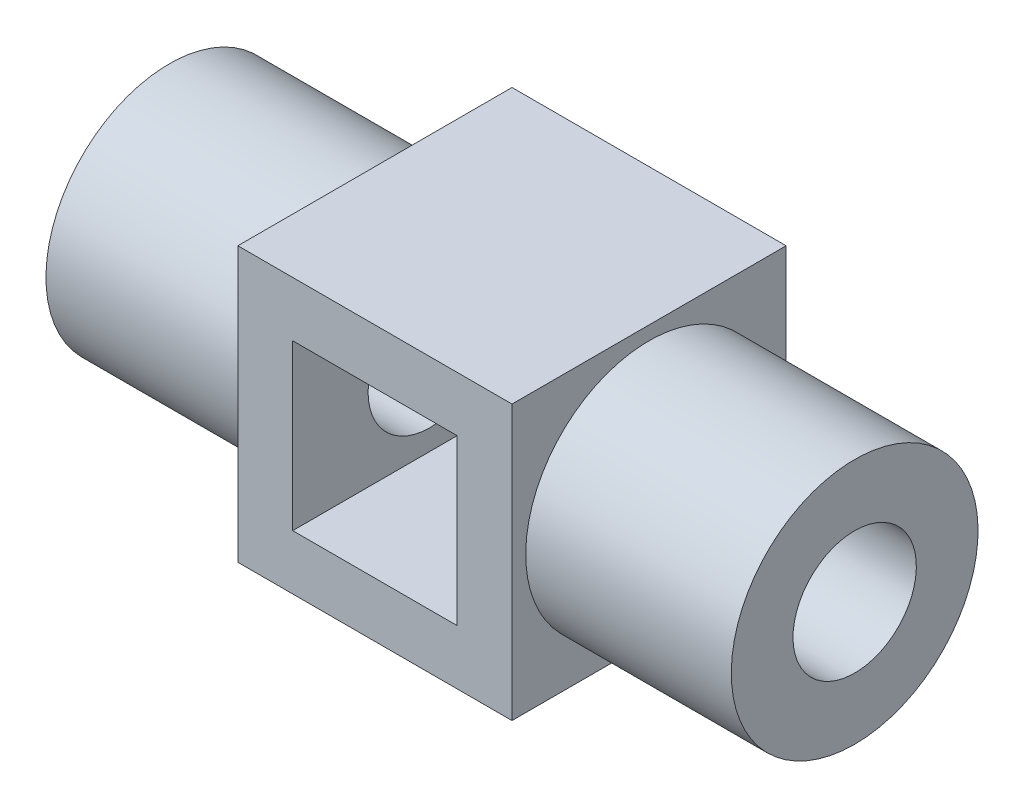
ISO-10303-21;
HEADER;
FILE_DESCRIPTION(('STEP AP214'),'2;1');
FILE_NAME('part.step','',(''),(''),'','','');
FILE_SCHEMA(('AUTOMOTIVE_DESIGN { 1 0 10303 214 1 1 1 1 }'));
ENDSEC;
DATA;
#1=APPLICATION_CONTEXT('core data for automotive mechanical design processes');
#2=APPLICATION_PROTOCOL_DEFINITION('international standard','automotive_design',2000,#1);
#3=PRODUCT_CONTEXT('',#1,'mechanical');
#4=PRODUCT('Part','Part','',(#3));
#5=PRODUCT_RELATED_PRODUCT_CATEGORY('part','',(#4));
#6=PRODUCT_DEFINITION_FORMATION('','',#4);
#7=PRODUCT_DEFINITION_CONTEXT('part definition',#1,'design');
#8=PRODUCT_DEFINITION('design','',#6,#7);
#9=PRODUCT_DEFINITION_SHAPE('','',#8);
#10=(LENGTH_UNIT() NAMED_UNIT(*) SI_UNIT(.MILLI.,.METRE.));
#11=(NAMED_UNIT(*) PLANE_ANGLE_UNIT() SI_UNIT($,.RADIAN.));
#12=(NAMED_UNIT(*) SI_UNIT($,.STERADIAN.) SOLID_ANGLE_UNIT());
#13=UNCERTAINTY_MEASURE_WITH_UNIT(LENGTH_MEASURE(1.E-05),#10,'distance_accuracy_value','');
#14=(GEOMETRIC_REPRESENTATION_CONTEXT(3) GLOBAL_UNCERTAINTY_ASSIGNED_CONTEXT((#13)) GLOBAL_UNIT_ASSIGNED_CONTEXT((#10,
#11,#12)) REPRESENTATION_CONTEXT('',''));
#15=CARTESIAN_POINT('',(0.,0.,0.));
#16=DIRECTION('',(0.,0.,1.));
#17=DIRECTION('',(1.,0.,0.));
#18=AXIS2_PLACEMENT_3D('',#15,#16,#17);
#19=CARTESIAN_POINT('',(0.,0.,40.));
#20=DIRECTION('',(0.,0.,1.));
#21=DIRECTION('',(1.,0.,0.));
#22=AXIS2_PLACEMENT_3D('',#19,#20,#21);
#23=PLANE('',#22);
#24=DIRECTION('',(0.,1.,0.));
#25=VECTOR('',#24,1.);
#26=CARTESIAN_POINT('',(20.,20.,40.));
#27=LINE('',#26,#25);
#28=CARTESIAN_POINT('',(20.,-20.,40.));
#29=VERTEX_POINT('',#28);
#30=CARTESIAN_POINT('',(20.,20.,40.));
#31=VERTEX_POINT('',#30);
#32=EDGE_CURVE('E159',#29,#31,#27,.T.);
#33=ORIENTED_EDGE('',*,*,#32,.T.);
#34=DIRECTION('',(-1.,0.,0.));
#35=VECTOR('',#34,1.);
#36=CARTESIAN_POINT('',(-20.,20.,40.));
#37=LINE('',#36,#35);
#38=CARTESIAN_POINT('',(-20.,20.,40.));
#39=VERTEX_POINT('',#38);
#40=EDGE_CURVE('E163',#31,#39,#37,.T.);
#41=ORIENTED_EDGE('',*,*,#40,.T.);
#42=DIRECTION('',(0.,-1.,0.));
#43=VECTOR('',#42,1.);
#44=CARTESIAN_POINT('',(-20.,20.,40.));
#45=LINE('',#44,#43);
#46=CARTESIAN_POINT('',(-20.,-20.,40.));
#47=VERTEX_POINT('',#46);
#48=EDGE_CURVE('E167',#39,#47,#45,.T.);
#49=ORIENTED_EDGE('',*,*,#48,.T.);
#50=DIRECTION('',(1.,0.,0.));
#51=VECTOR('',#50,1.);
#52=CARTESIAN_POINT('',(-20.,-20.,40.));
#53=LINE('',#52,#51);
#54=EDGE_CURVE('E170',#47,#29,#53,.T.);
#55=ORIENTED_EDGE('',*,*,#54,.T.);
#56=EDGE_LOOP('',(#33,#41,#49,#55));
#57=FACE_BOUND('',#56,.T.);
#58=DIRECTION('',(-1.,0.,0.));
#59=VECTOR('',#58,1.);
#60=CARTESIAN_POINT('',(-12.,12.,40.));
#61=LINE('',#60,#59);
#62=CARTESIAN_POINT('',(12.,12.,40.));
#63=VERTEX_POINT('',#62);
#64=CARTESIAN_POINT('',(-12.,12.,40.));
#65=VERTEX_POINT('',#64);
#66=EDGE_CURVE('E119',#63,#65,#61,.T.);
#67=ORIENTED_EDGE('',*,*,#66,.F.);
#68=DIRECTION('',(0.,1.,0.));
#69=VECTOR('',#68,1.);
#70=CARTESIAN_POINT('',(12.,12.,40.));
#71=LINE('',#70,#69);
#72=CARTESIAN_POINT('',(12.,-12.,40.));
#73=VERTEX_POINT('',#72);
#74=EDGE_CURVE('E110',#73,#63,#71,.T.);
#75=ORIENTED_EDGE('',*,*,#74,.F.);
#76=DIRECTION('',(1.,0.,0.));
#77=VECTOR('',#76,1.);
#78=CARTESIAN_POINT('',(-12.,-12.,40.));
#79=LINE('',#78,#77);
#80=CARTESIAN_POINT('',(-12.,-12.,40.));
#81=VERTEX_POINT('',#80);
#82=EDGE_CURVE('E136',#81,#73,#79,.T.);
#83=ORIENTED_EDGE('',*,*,#82,.F.);
#84=DIRECTION('',(0.,-1.,0.));
#85=VECTOR('',#84,1.);
#86=CARTESIAN_POINT('',(-12.,12.,40.));
#87=LINE('',#86,#85);
#88=EDGE_CURVE('E132',#65,#81,#87,.T.);
#89=ORIENTED_EDGE('',*,*,#88,.F.);
#90=EDGE_LOOP('',(#67,#75,#83,#89));
#91=FACE_BOUND('',#90,.T.);
#92=ADVANCED_FACE('F43',(#57,#91),#23,.T.);
#93=CARTESIAN_POINT('',(0.,0.,0.));
#94=DIRECTION('',(0.,0.,1.));
#95=DIRECTION('',(1.,0.,0.));
#96=AXIS2_PLACEMENT_3D('',#93,#94,#95);
#97=PLANE('',#96);
#98=DIRECTION('',(0.,1.,0.));
#99=VECTOR('',#98,1.);
#100=CARTESIAN_POINT('',(20.,20.,0.));
#101=LINE('',#100,#99);
#102=CARTESIAN_POINT('',(20.,-20.,0.));
#103=VERTEX_POINT('',#102);
#104=CARTESIAN_POINT('',(20.,20.,0.));
#105=VERTEX_POINT('',#104);
#106=EDGE_CURVE('E128',#103,#105,#101,.T.);
#107=ORIENTED_EDGE('',*,*,#106,.F.);
#108=DIRECTION('',(1.,0.,0.));
#109=VECTOR('',#108,1.);
#110=CARTESIAN_POINT('',(-20.,-20.,0.));
#111=LINE('',#110,#109);
#112=CARTESIAN_POINT('',(-20.,-20.,0.));
#113=VERTEX_POINT('',#112);
#114=EDGE_CURVE('E164',#113,#103,#111,.T.);
#115=ORIENTED_EDGE('',*,*,#114,.F.);
#116=DIRECTION('',(0.,-1.,0.));
#117=VECTOR('',#116,1.);
#118=CARTESIAN_POINT('',(-20.,20.,0.));
#119=LINE('',#118,#117);
#120=CARTESIAN_POINT('',(-20.,20.,0.));
#121=VERTEX_POINT('',#120);
#122=EDGE_CURVE('E180',#121,#113,#119,.T.);
#123=ORIENTED_EDGE('',*,*,#122,.F.);
#124=DIRECTION('',(-1.,0.,0.));
#125=VECTOR('',#124,1.);
#126=CARTESIAN_POINT('',(-20.,20.,0.));
#127=LINE('',#126,#125);
#128=EDGE_CURVE('E177',#105,#121,#127,.T.);
#129=ORIENTED_EDGE('',*,*,#128,.F.);
#130=EDGE_LOOP('',(#107,#115,#123,#129));
#131=FACE_BOUND('',#130,.T.);
#132=DIRECTION('',(0.,1.,0.));
#133=VECTOR('',#132,1.);
#134=CARTESIAN_POINT('',(12.,12.,0.));
#135=LINE('',#134,#133);
#136=CARTESIAN_POINT('',(12.,-12.,0.));
#137=VERTEX_POINT('',#136);
#138=CARTESIAN_POINT('',(12.,12.,0.));
#139=VERTEX_POINT('',#138);
#140=EDGE_CURVE('E68',#137,#139,#135,.T.);
#141=ORIENTED_EDGE('',*,*,#140,.T.);
#142=DIRECTION('',(-1.,0.,0.));
#143=VECTOR('',#142,1.);
#144=CARTESIAN_POINT('',(-12.,12.,0.));
#145=LINE('',#144,#143);
#146=CARTESIAN_POINT('',(-12.,12.,0.));
#147=VERTEX_POINT('',#146);
#148=EDGE_CURVE('E126',#139,#147,#145,.T.);
#149=ORIENTED_EDGE('',*,*,#148,.T.);
#150=DIRECTION('',(0.,-1.,0.));
#151=VECTOR('',#150,1.);
#152=CARTESIAN_POINT('',(-12.,12.,0.));
#153=LINE('',#152,#151);
#154=CARTESIAN_POINT('',(-12.,-12.,0.));
#155=VERTEX_POINT('',#154);
#156=EDGE_CURVE('E146',#147,#155,#153,.T.);
#157=ORIENTED_EDGE('',*,*,#156,.T.);
#158=DIRECTION('',(1.,0.,0.));
#159=VECTOR('',#158,1.);
#160=CARTESIAN_POINT('',(-12.,-12.,0.));
#161=LINE('',#160,#159);
#162=EDGE_CURVE('E120',#155,#137,#161,.T.);
#163=ORIENTED_EDGE('',*,*,#162,.T.);
#164=EDGE_LOOP('',(#141,#149,#157,#163));
#165=FACE_BOUND('',#164,.T.);
#166=ADVANCED_FACE('F209',(#131,#165),#97,.F.);
#167=CARTESIAN_POINT('',(20.,20.,40.));
#168=DIRECTION('',(-1.,0.,0.));
#169=DIRECTION('',(0.,-1.,0.));
#170=AXIS2_PLACEMENT_3D('',#167,#168,#169);
#171=PLANE('',#170);
#172=CARTESIAN_POINT('',(20.,0.,20.));
#173=DIRECTION('',(-1.,0.,0.));
#174=DIRECTION('',(0.,-1.,0.));
#175=AXIS2_PLACEMENT_3D('',#172,#173,#174);
#176=CIRCLE('',#175,18.);
#177=CARTESIAN_POINT('',(20.,-18.,20.));
#178=VERTEX_POINT('',#177);
#179=EDGE_CURVE('E239',#178,#178,#176,.T.);
#180=ORIENTED_EDGE('',*,*,#179,.T.);
#181=EDGE_LOOP('',(#180));
#182=FACE_BOUND('',#181,.T.);
#183=ORIENTED_EDGE('',*,*,#106,.T.);
#184=DIRECTION('',(0.,0.,-1.));
#185=VECTOR('',#184,1.);
#186=CARTESIAN_POINT('',(20.,20.,40.));
#187=LINE('',#186,#185);
#188=EDGE_CURVE('E47',#31,#105,#187,.T.);
#189=ORIENTED_EDGE('',*,*,#188,.F.);
#190=ORIENTED_EDGE('',*,*,#32,.F.);
#191=DIRECTION('',(0.,0.,-1.));
#192=VECTOR('',#191,1.);
#193=CARTESIAN_POINT('',(20.,-20.,40.));
#194=LINE('',#193,#192);
#195=EDGE_CURVE('E173',#29,#103,#194,.T.);
#196=ORIENTED_EDGE('',*,*,#195,.T.);
#197=EDGE_LOOP('',(#183,#189,#190,#196));
#198=FACE_BOUND('',#197,.T.);
#199=ADVANCED_FACE('F45',(#182,#198),#171,.F.);
#200=CARTESIAN_POINT('',(-20.,20.,40.));
#201=DIRECTION('',(0.,-1.,0.));
#202=DIRECTION('',(0.,0.,-1.));
#203=AXIS2_PLACEMENT_3D('',#200,#201,#202);
#204=PLANE('',#203);
#205=ORIENTED_EDGE('',*,*,#128,.T.);
#206=DIRECTION('',(0.,0.,-1.));
#207=VECTOR('',#206,1.);
#208=CARTESIAN_POINT('',(-20.,20.,40.));
#209=LINE('',#208,#207);
#210=EDGE_CURVE('E191',#39,#121,#209,.T.);
#211=ORIENTED_EDGE('',*,*,#210,.F.);
#212=ORIENTED_EDGE('',*,*,#40,.F.);
#213=ORIENTED_EDGE('',*,*,#188,.T.);
#214=EDGE_LOOP('',(#205,#211,#212,#213));
#215=FACE_BOUND('',#214,.T.);
#216=ADVANCED_FACE('F202',(#215),#204,.F.);
#217=CARTESIAN_POINT('',(-20.,20.,40.));
#218=DIRECTION('',(1.,0.,0.));
#219=DIRECTION('',(0.,1.,0.));
#220=AXIS2_PLACEMENT_3D('',#217,#218,#219);
#221=PLANE('',#220);
#222=CARTESIAN_POINT('',(-20.,0.,20.));
#223=DIRECTION('',(-1.,0.,0.));
#224=DIRECTION('',(0.,-1.,0.));
#225=AXIS2_PLACEMENT_3D('',#222,#223,#224);
#226=CIRCLE('',#225,18.);
#227=CARTESIAN_POINT('',(-20.,-18.,20.));
#228=VERTEX_POINT('',#227);
#229=EDGE_CURVE('E11',#228,#228,#226,.T.);
#230=ORIENTED_EDGE('',*,*,#229,.F.);
#231=EDGE_LOOP('',(#230));
#232=FACE_BOUND('',#231,.T.);
#233=ORIENTED_EDGE('',*,*,#122,.T.);
#234=DIRECTION('',(0.,0.,-1.));
#235=VECTOR('',#234,1.);
#236=CARTESIAN_POINT('',(-20.,-20.,40.));
#237=LINE('',#236,#235);
#238=EDGE_CURVE('E188',#47,#113,#237,.T.);
#239=ORIENTED_EDGE('',*,*,#238,.F.);
#240=ORIENTED_EDGE('',*,*,#48,.F.);
#241=ORIENTED_EDGE('',*,*,#210,.T.);
#242=EDGE_LOOP('',(#233,#239,#240,#241));
#243=FACE_BOUND('',#242,.T.);
#244=ADVANCED_FACE('F212',(#232,#243),#221,.F.);
#245=CARTESIAN_POINT('',(-20.,-20.,40.));
#246=DIRECTION('',(0.,1.,0.));
#247=DIRECTION('',(0.,0.,1.));
#248=AXIS2_PLACEMENT_3D('',#245,#246,#247);
#249=PLANE('',#248);
#250=ORIENTED_EDGE('',*,*,#114,.T.);
#251=ORIENTED_EDGE('',*,*,#195,.F.);
#252=ORIENTED_EDGE('',*,*,#54,.F.);
#253=ORIENTED_EDGE('',*,*,#238,.T.);
#254=EDGE_LOOP('',(#250,#251,#252,#253));
#255=FACE_BOUND('',#254,.T.);
#256=ADVANCED_FACE('F215',(#255),#249,.F.);
#257=CARTESIAN_POINT('',(12.,12.,40.));
#258=DIRECTION('',(-1.,0.,0.));
#259=DIRECTION('',(0.,-1.,0.));
#260=AXIS2_PLACEMENT_3D('',#257,#258,#259);
#261=PLANE('',#260);
#262=CARTESIAN_POINT('',(12.,0.,20.));
#263=DIRECTION('',(-1.,0.,0.));
#264=DIRECTION('',(0.,-1.,0.));
#265=AXIS2_PLACEMENT_3D('',#262,#263,#264);
#266=CIRCLE('',#265,9.);
#267=CARTESIAN_POINT('',(12.,9.,20.));
#268=VERTEX_POINT('',#267);
#269=EDGE_CURVE('E243',#268,#268,#266,.F.);
#270=ORIENTED_EDGE('',*,*,#269,.T.);
#271=EDGE_LOOP('',(#270));
#272=FACE_BOUND('',#271,.T.);
#273=ORIENTED_EDGE('',*,*,#140,.F.);
#274=DIRECTION('',(0.,0.,-1.));
#275=VECTOR('',#274,1.);
#276=CARTESIAN_POINT('',(12.,-12.,40.));
#277=LINE('',#276,#275);
#278=EDGE_CURVE('E114',#73,#137,#277,.T.);
#279=ORIENTED_EDGE('',*,*,#278,.F.);
#280=ORIENTED_EDGE('',*,*,#74,.T.);
#281=DIRECTION('',(0.,0.,-1.));
#282=VECTOR('',#281,1.);
#283=CARTESIAN_POINT('',(12.,12.,40.));
#284=LINE('',#283,#282);
#285=EDGE_CURVE('E113',#63,#139,#284,.T.);
#286=ORIENTED_EDGE('',*,*,#285,.T.);
#287=EDGE_LOOP('',(#273,#279,#280,#286));
#288=FACE_BOUND('',#287,.T.);
#289=ADVANCED_FACE('F112',(#272,#288),#261,.T.);
#290=CARTESIAN_POINT('',(-12.,12.,40.));
#291=DIRECTION('',(0.,-1.,0.));
#292=DIRECTION('',(0.,0.,-1.));
#293=AXIS2_PLACEMENT_3D('',#290,#291,#292);
#294=PLANE('',#293);
#295=ORIENTED_EDGE('',*,*,#148,.F.);
#296=ORIENTED_EDGE('',*,*,#285,.F.);
#297=ORIENTED_EDGE('',*,*,#66,.T.);
#298=DIRECTION('',(0.,0.,-1.));
#299=VECTOR('',#298,1.);
#300=CARTESIAN_POINT('',(-12.,12.,40.));
#301=LINE('',#300,#299);
#302=EDGE_CURVE('E129',#65,#147,#301,.T.);
#303=ORIENTED_EDGE('',*,*,#302,.T.);
#304=EDGE_LOOP('',(#295,#296,#297,#303));
#305=FACE_BOUND('',#304,.T.);
#306=ADVANCED_FACE('F123',(#305),#294,.T.);
#307=CARTESIAN_POINT('',(-12.,12.,40.));
#308=DIRECTION('',(1.,0.,0.));
#309=DIRECTION('',(0.,1.,0.));
#310=AXIS2_PLACEMENT_3D('',#307,#308,#309);
#311=PLANE('',#310);
#312=CARTESIAN_POINT('',(-12.,0.,20.));
#313=DIRECTION('',(1.,0.,0.));
#314=DIRECTION('',(0.,1.,0.));
#315=AXIS2_PLACEMENT_3D('',#312,#313,#314);
#316=CIRCLE('',#315,9.);
#317=CARTESIAN_POINT('',(-12.,9.,20.));
#318=VERTEX_POINT('',#317);
#319=EDGE_CURVE('E257',#318,#318,#316,.F.);
#320=ORIENTED_EDGE('',*,*,#319,.T.);
#321=EDGE_LOOP('',(#320));
#322=FACE_BOUND('',#321,.T.);
#323=ORIENTED_EDGE('',*,*,#156,.F.);
#324=ORIENTED_EDGE('',*,*,#302,.F.);
#325=ORIENTED_EDGE('',*,*,#88,.T.);
#326=DIRECTION('',(0.,0.,-1.));
#327=VECTOR('',#326,1.);
#328=CARTESIAN_POINT('',(-12.,-12.,40.));
#329=LINE('',#328,#327);
#330=EDGE_CURVE('E60',#81,#155,#329,.T.);
#331=ORIENTED_EDGE('',*,*,#330,.T.);
#332=EDGE_LOOP('',(#323,#324,#325,#331));
#333=FACE_BOUND('',#332,.T.);
#334=ADVANCED_FACE('F280',(#322,#333),#311,.T.);
#335=CARTESIAN_POINT('',(-12.,-12.,40.));
#336=DIRECTION('',(0.,1.,0.));
#337=DIRECTION('',(0.,0.,1.));
#338=AXIS2_PLACEMENT_3D('',#335,#336,#337);
#339=PLANE('',#338);
#340=ORIENTED_EDGE('',*,*,#162,.F.);
#341=ORIENTED_EDGE('',*,*,#330,.F.);
#342=ORIENTED_EDGE('',*,*,#82,.T.);
#343=ORIENTED_EDGE('',*,*,#278,.T.);
#344=EDGE_LOOP('',(#340,#341,#342,#343));
#345=FACE_BOUND('',#344,.T.);
#346=ADVANCED_FACE('F270',(#345),#339,.T.);
#347=CARTESIAN_POINT('',(-50.,0.,20.));
#348=DIRECTION('',(1.,0.,0.));
#349=DIRECTION('',(0.,1.,0.));
#350=AXIS2_PLACEMENT_3D('',#347,#348,#349);
#351=CYLINDRICAL_SURFACE('',#350,18.);
#352=CARTESIAN_POINT('',(-50.,0.,20.));
#353=DIRECTION('',(-1.,0.,0.));
#354=DIRECTION('',(0.,-1.,0.));
#355=AXIS2_PLACEMENT_3D('',#352,#353,#354);
#356=CIRCLE('',#355,18.);
#357=CARTESIAN_POINT('',(-50.,-18.,20.));
#358=VERTEX_POINT('',#357);
#359=EDGE_CURVE('E143',#358,#358,#356,.T.);
#360=ORIENTED_EDGE('',*,*,#359,.F.);
#361=EDGE_LOOP('',(#360));
#362=FACE_BOUND('',#361,.T.);
#363=ORIENTED_EDGE('',*,*,#229,.T.);
#364=EDGE_LOOP('',(#363));
#365=FACE_BOUND('',#364,.T.);
#366=ADVANCED_FACE('F267',(#362,#365),#351,.T.);
#367=CARTESIAN_POINT('',(-50.,0.,20.));
#368=DIRECTION('',(-1.,0.,0.));
#369=DIRECTION('',(0.,-1.,0.));
#370=AXIS2_PLACEMENT_3D('',#367,#368,#369);
#371=PLANE('',#370);
#372=CARTESIAN_POINT('',(-50.,0.,20.));
#373=DIRECTION('',(-1.,0.,0.));
#374=DIRECTION('',(0.,-1.,0.));
#375=AXIS2_PLACEMENT_3D('',#372,#373,#374);
#376=CIRCLE('',#375,9.);
#377=CARTESIAN_POINT('',(-50.,-9.00000000000001,20.));
#378=VERTEX_POINT('',#377);
#379=EDGE_CURVE('E248',#378,#378,#376,.T.);
#380=ORIENTED_EDGE('',*,*,#379,.F.);
#381=EDGE_LOOP('',(#380));
#382=FACE_BOUND('',#381,.T.);
#383=ORIENTED_EDGE('',*,*,#359,.T.);
#384=EDGE_LOOP('',(#383));
#385=FACE_BOUND('',#384,.T.);
#386=ADVANCED_FACE('F265',(#382,#385),#371,.T.);
#387=CARTESIAN_POINT('',(13.4558441227157,0.,20.));
#388=DIRECTION('',(-1.,0.,0.));
#389=DIRECTION('',(0.,-1.,0.));
#390=AXIS2_PLACEMENT_3D('',#387,#388,#389);
#391=CYLINDRICAL_SURFACE('',#390,9.);
#392=ORIENTED_EDGE('',*,*,#379,.T.);
#393=EDGE_LOOP('',(#392));
#394=FACE_BOUND('',#393,.T.);
#395=ORIENTED_EDGE('',*,*,#319,.F.);
#396=EDGE_LOOP('',(#395));
#397=FACE_BOUND('',#396,.T.);
#398=ADVANCED_FACE('F277',(#394,#397),#391,.F.);
#399=CARTESIAN_POINT('',(50.,0.,20.));
#400=DIRECTION('',(-1.,0.,0.));
#401=DIRECTION('',(0.,-1.,0.));
#402=AXIS2_PLACEMENT_3D('',#399,#400,#401);
#403=CYLINDRICAL_SURFACE('',#402,18.);
#404=CARTESIAN_POINT('',(50.,0.,20.));
#405=DIRECTION('',(-1.,0.,0.));
#406=DIRECTION('',(0.,-1.,0.));
#407=AXIS2_PLACEMENT_3D('',#404,#405,#406);
#408=CIRCLE('',#407,18.);
#409=CARTESIAN_POINT('',(50.,-18.,20.));
#410=VERTEX_POINT('',#409);
#411=EDGE_CURVE('E242',#410,#410,#408,.T.);
#412=ORIENTED_EDGE('',*,*,#411,.T.);
#413=EDGE_LOOP('',(#412));
#414=FACE_BOUND('',#413,.T.);
#415=ORIENTED_EDGE('',*,*,#179,.F.);
#416=EDGE_LOOP('',(#415));
#417=FACE_BOUND('',#416,.T.);
#418=ADVANCED_FACE('F307',(#414,#417),#403,.T.);
#419=CARTESIAN_POINT('',(50.,0.,20.));
#420=DIRECTION('',(1.,0.,0.));
#421=DIRECTION('',(0.,-1.,0.));
#422=AXIS2_PLACEMENT_3D('',#419,#420,#421);
#423=PLANE('',#422);
#424=CARTESIAN_POINT('',(50.,0.,20.));
#425=DIRECTION('',(-1.,0.,0.));
#426=DIRECTION('',(0.,-1.,0.));
#427=AXIS2_PLACEMENT_3D('',#424,#425,#426);
#428=CIRCLE('',#427,9.);
#429=CARTESIAN_POINT('',(50.,8.99999999999999,20.));
#430=VERTEX_POINT('',#429);
#431=EDGE_CURVE('E251',#430,#430,#428,.T.);
#432=ORIENTED_EDGE('',*,*,#431,.T.);
#433=EDGE_LOOP('',(#432));
#434=FACE_BOUND('',#433,.T.);
#435=ORIENTED_EDGE('',*,*,#411,.F.);
#436=EDGE_LOOP('',(#435));
#437=FACE_BOUND('',#436,.T.);
#438=ADVANCED_FACE('F298',(#434,#437),#423,.T.);
#439=CARTESIAN_POINT('',(-37.4558441227157,0.,20.));
#440=DIRECTION('',(1.,0.,0.));
#441=DIRECTION('',(0.,1.,0.));
#442=AXIS2_PLACEMENT_3D('',#439,#440,#441);
#443=CYLINDRICAL_SURFACE('',#442,9.);
#444=CARTESIAN_POINT('',(12.,9.,20.));
#445=CARTESIAN_POINT('',(12.3958333333333,9.,20.));
#446=CARTESIAN_POINT('',(12.7916666666667,9.,20.));
#447=CARTESIAN_POINT('',(13.5833333333333,9.,20.));
#448=CARTESIAN_POINT('',(13.9791666666667,9.,20.));
#449=CARTESIAN_POINT('',(14.7708333333333,9.,20.));
#450=CARTESIAN_POINT('',(15.1666666666667,9.,20.));
#451=CARTESIAN_POINT('',(15.9583333333333,9.,20.));
#452=CARTESIAN_POINT('',(16.3541666666667,9.,20.));
#453=CARTESIAN_POINT('',(17.1458333333333,9.,20.));
#454=CARTESIAN_POINT('',(17.5416666666667,9.,20.));
#455=CARTESIAN_POINT('',(18.3333333333333,9.,20.));
#456=CARTESIAN_POINT('',(18.7291666666667,9.,20.));
#457=CARTESIAN_POINT('',(19.5208333333333,9.,20.));
#458=CARTESIAN_POINT('',(19.9166666666667,9.,20.));
#459=CARTESIAN_POINT('',(20.7083333333333,9.,20.));
#460=CARTESIAN_POINT('',(21.1041666666667,9.,20.));
#461=CARTESIAN_POINT('',(21.8958333333333,9.,20.));
#462=CARTESIAN_POINT('',(22.2916666666667,9.,20.));
#463=CARTESIAN_POINT('',(23.0833333333333,9.,20.));
#464=CARTESIAN_POINT('',(23.4791666666667,9.,20.));
#465=CARTESIAN_POINT('',(24.2708333333333,9.,20.));
#466=CARTESIAN_POINT('',(24.6666666666667,9.,20.));
#467=CARTESIAN_POINT('',(25.4583333333333,9.,20.));
#468=CARTESIAN_POINT('',(25.8541666666667,9.,20.));
#469=CARTESIAN_POINT('',(26.6458333333333,9.,20.));
#470=CARTESIAN_POINT('',(27.0416666666667,9.,20.));
#471=CARTESIAN_POINT('',(27.8333333333333,9.,20.));
#472=CARTESIAN_POINT('',(28.2291666666667,8.99999999999999,20.));
#473=CARTESIAN_POINT('',(29.0208333333333,8.99999999999999,20.));
#474=CARTESIAN_POINT('',(29.4166666666667,8.99999999999999,20.));
#475=CARTESIAN_POINT('',(30.2083333333333,8.99999999999999,20.));
#476=CARTESIAN_POINT('',(30.6041666666667,8.99999999999999,20.));
#477=CARTESIAN_POINT('',(31.3958333333333,8.99999999999999,20.));
#478=CARTESIAN_POINT('',(31.7916666666667,8.99999999999999,20.));
#479=CARTESIAN_POINT('',(32.5833333333333,8.99999999999999,20.));
#480=CARTESIAN_POINT('',(32.9791666666667,8.99999999999999,20.));
#481=CARTESIAN_POINT('',(33.7708333333333,8.99999999999999,20.));
#482=CARTESIAN_POINT('',(34.1666666666667,8.99999999999999,20.));
#483=CARTESIAN_POINT('',(34.9583333333333,8.99999999999999,20.));
#484=CARTESIAN_POINT('',(35.3541666666667,8.99999999999999,20.));
#485=CARTESIAN_POINT('',(36.1458333333333,8.99999999999999,20.));
#486=CARTESIAN_POINT('',(36.5416666666667,8.99999999999999,20.));
#487=CARTESIAN_POINT('',(37.3333333333333,8.99999999999999,20.));
#488=CARTESIAN_POINT('',(37.7291666666667,8.99999999999999,20.));
#489=CARTESIAN_POINT('',(38.5208333333333,8.99999999999999,20.));
#490=CARTESIAN_POINT('',(38.9166666666667,8.99999999999999,20.));
#491=CARTESIAN_POINT('',(39.7083333333333,8.99999999999999,20.));
#492=CARTESIAN_POINT('',(40.1041666666667,8.99999999999999,20.));
#493=CARTESIAN_POINT('',(40.8958333333333,8.99999999999999,20.));
#494=CARTESIAN_POINT('',(41.2916666666667,8.99999999999999,20.));
#495=CARTESIAN_POINT('',(42.0833333333333,8.99999999999999,20.));
#496=CARTESIAN_POINT('',(42.4791666666667,8.99999999999999,20.));
#497=CARTESIAN_POINT('',(43.2708333333333,8.99999999999999,20.));
#498=CARTESIAN_POINT('',(43.6666666666667,8.99999999999999,20.));
#499=CARTESIAN_POINT('',(44.4583333333333,8.99999999999999,20.));
#500=CARTESIAN_POINT('',(44.8541666666667,8.99999999999999,20.));
#501=CARTESIAN_POINT('',(45.6458333333333,8.99999999999999,20.));
#502=CARTESIAN_POINT('',(46.0416666666667,8.99999999999999,20.));
#503=CARTESIAN_POINT('',(46.8333333333333,8.99999999999999,20.));
#504=CARTESIAN_POINT('',(47.2291666666667,8.99999999999999,20.));
#505=CARTESIAN_POINT('',(48.0208333333333,8.99999999999999,20.));
#506=CARTESIAN_POINT('',(48.4166666666667,8.99999999999999,20.));
#507=CARTESIAN_POINT('',(49.2083333333333,8.99999999999999,20.));
#508=CARTESIAN_POINT('',(49.6041666666667,8.99999999999999,20.));
#509=CARTESIAN_POINT('',(50.,8.99999999999999,20.));
#510=B_SPLINE_CURVE_WITH_KNOTS('',3,(#444,#445,#446,#447,#448,#449,#450,#451,#452,#453,#454,
#455,#456,#457,#458,#459,#460,#461,#462,#463,#464,#465,#466,#467,#468,#469,#470,#471,#472,#473,
#474,#475,#476,#477,#478,#479,#480,#481,#482,#483,#484,#485,#486,#487,#488,#489,#490,#491,#492,
#493,#494,#495,#496,#497,#498,#499,#500,#501,#502,#503,#504,#505,#506,#507,#508,#509),
.UNSPECIFIED.,.F.,.F.,(4,2,2,2,2,2,2,2,2,2,2,2,2,2,2,2,2,2,2,2,2,2,2,2,2,2,2,2,2,2,2,2,4),(0.,
1.1875,2.375,3.5625,4.75,5.93750000000001,7.12500000000001,8.3125,9.50000000000001,10.6875,
11.875,13.0625,14.25,15.4375,16.625,17.8125,19.,20.1875,21.375,22.5625,23.75,24.9375,26.125,
27.3125,28.5,29.6875,30.875,32.0625,33.25,34.4375,35.625,36.8125,38.),.UNSPECIFIED.);
#511=EDGE_CURVE('BSEAM295',#268,#430,#510,.T.);
#512=ORIENTED_EDGE('',*,*,#269,.F.);
#513=ORIENTED_EDGE('',*,*,#431,.F.);
#514=ORIENTED_EDGE('',*,*,#511,.T.);
#515=ORIENTED_EDGE('',*,*,#511,.F.);
#516=EDGE_LOOP('',(#512,#514,#513,#515));
#517=FACE_BOUND('',#516,.T.);
#518=ADVANCED_FACE('F295',(#517),#443,.F.);
#519=CLOSED_SHELL('',(#92,#166,#199,#216,#244,#256,#289,#306,#334,#346,#366,#386,#398,#418,#438,#518));
#520=MANIFOLD_SOLID_BREP('B2',#519);
#521=ADVANCED_BREP_SHAPE_REPRESENTATION('',(#18,#520),#14);
#522=SHAPE_DEFINITION_REPRESENTATION(#9,#521);
ENDSEC;
END-ISO-10303-21;
